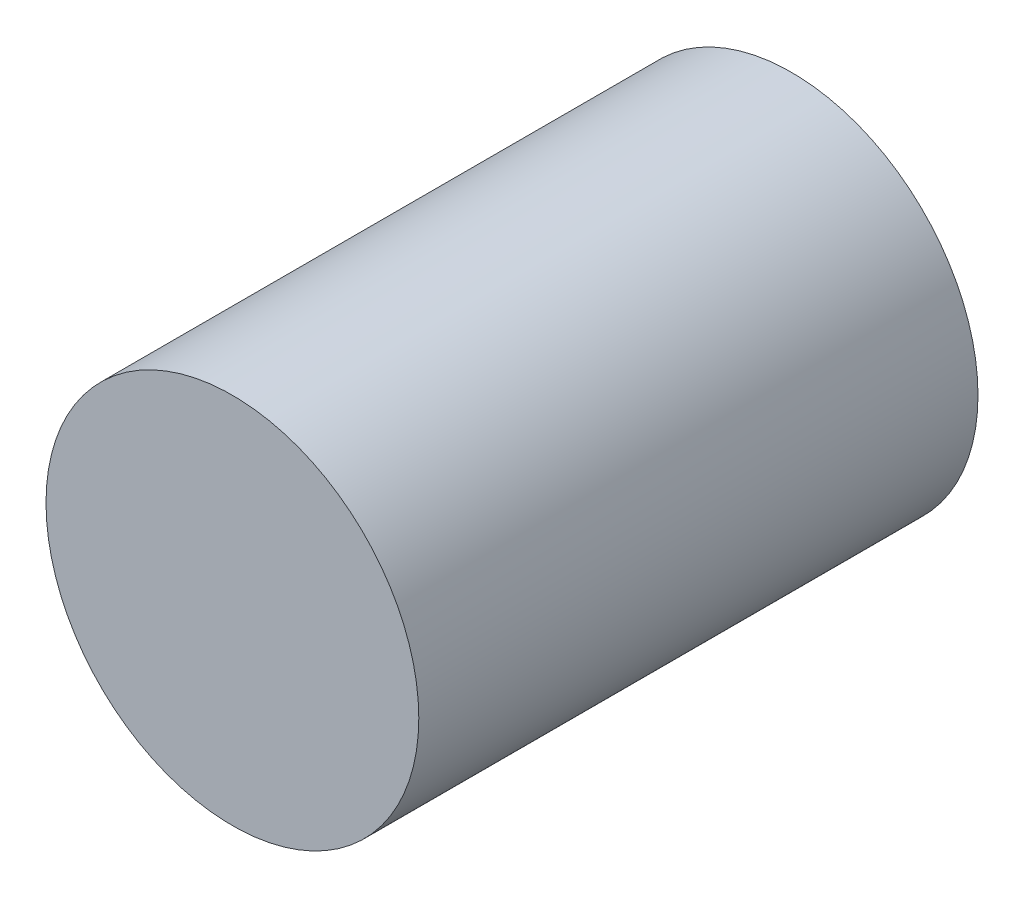
ISO-10303-21;
HEADER;
FILE_DESCRIPTION(('STEP AP214'),'2;1');
FILE_NAME('part.step','',(''),(''),'','','');
FILE_SCHEMA(('AUTOMOTIVE_DESIGN { 1 0 10303 214 1 1 1 1 }'));
ENDSEC;
DATA;
#1=APPLICATION_CONTEXT('core data for automotive mechanical design processes');
#2=APPLICATION_PROTOCOL_DEFINITION('international standard','automotive_design',2000,#1);
#3=PRODUCT_CONTEXT('',#1,'mechanical');
#4=PRODUCT('Part','Part','',(#3));
#5=PRODUCT_RELATED_PRODUCT_CATEGORY('part','',(#4));
#6=PRODUCT_DEFINITION_FORMATION('','',#4);
#7=PRODUCT_DEFINITION_CONTEXT('part definition',#1,'design');
#8=PRODUCT_DEFINITION('design','',#6,#7);
#9=PRODUCT_DEFINITION_SHAPE('','',#8);
#10=(LENGTH_UNIT() NAMED_UNIT(*) SI_UNIT(.MILLI.,.METRE.));
#11=(NAMED_UNIT(*) PLANE_ANGLE_UNIT() SI_UNIT($,.RADIAN.));
#12=(NAMED_UNIT(*) SI_UNIT($,.STERADIAN.) SOLID_ANGLE_UNIT());
#13=UNCERTAINTY_MEASURE_WITH_UNIT(LENGTH_MEASURE(1.E-05),#10,'distance_accuracy_value','');
#14=(GEOMETRIC_REPRESENTATION_CONTEXT(3) GLOBAL_UNCERTAINTY_ASSIGNED_CONTEXT((#13)) GLOBAL_UNIT_ASSIGNED_CONTEXT((#10,
#11,#12)) REPRESENTATION_CONTEXT('',''));
#15=CARTESIAN_POINT('',(0.,0.,0.));
#16=DIRECTION('',(0.,0.,1.));
#17=DIRECTION('',(1.,0.,0.));
#18=AXIS2_PLACEMENT_3D('',#15,#16,#17);
#19=CARTESIAN_POINT('',(0.,0.,30.));
#20=DIRECTION('',(0.,0.,-1.));
#21=DIRECTION('',(-1.,0.,0.));
#22=AXIS2_PLACEMENT_3D('',#19,#20,#21);
#23=CYLINDRICAL_SURFACE('',#22,10.);
#24=CARTESIAN_POINT('',(0.,0.,30.));
#25=DIRECTION('',(0.,0.,1.));
#26=DIRECTION('',(1.,0.,0.));
#27=AXIS2_PLACEMENT_3D('',#24,#25,#26);
#28=CIRCLE('',#27,10.);
#29=CARTESIAN_POINT('',(10.,0.,30.));
#30=VERTEX_POINT('',#29);
#31=EDGE_CURVE('E10',#30,#30,#28,.T.);
#32=ORIENTED_EDGE('',*,*,#31,.F.);
#33=EDGE_LOOP('',(#32));
#34=FACE_BOUND('',#33,.T.);
#35=CARTESIAN_POINT('',(0.,0.,0.));
#36=DIRECTION('',(0.,0.,1.));
#37=DIRECTION('',(1.,0.,0.));
#38=AXIS2_PLACEMENT_3D('',#35,#36,#37);
#39=CIRCLE('',#38,10.);
#40=CARTESIAN_POINT('',(10.,0.,0.));
#41=VERTEX_POINT('',#40);
#42=EDGE_CURVE('E42',#41,#41,#39,.T.);
#43=ORIENTED_EDGE('',*,*,#42,.T.);
#44=EDGE_LOOP('',(#43));
#45=FACE_BOUND('',#44,.T.);
#46=ADVANCED_FACE('F39',(#34,#45),#23,.T.);
#47=CARTESIAN_POINT('',(0.,0.,30.));
#48=DIRECTION('',(0.,0.,1.));
#49=DIRECTION('',(1.,0.,0.));
#50=AXIS2_PLACEMENT_3D('',#47,#48,#49);
#51=PLANE('',#50);
#52=ORIENTED_EDGE('',*,*,#31,.T.);
#53=EDGE_LOOP('',(#52));
#54=FACE_BOUND('',#53,.T.);
#55=ADVANCED_FACE('F54',(#54),#51,.T.);
#56=CARTESIAN_POINT('',(0.,0.,0.));
#57=DIRECTION('',(0.,0.,1.));
#58=DIRECTION('',(1.,0.,0.));
#59=AXIS2_PLACEMENT_3D('',#56,#57,#58);
#60=PLANE('',#59);
#61=ORIENTED_EDGE('',*,*,#42,.F.);
#62=EDGE_LOOP('',(#61));
#63=FACE_BOUND('',#62,.T.);
#64=ADVANCED_FACE('F52',(#63),#60,.F.);
#65=CLOSED_SHELL('',(#46,#55,#64));
#66=MANIFOLD_SOLID_BREP('B2',#65);
#67=ADVANCED_BREP_SHAPE_REPRESENTATION('',(#18,#66),#14);
#68=SHAPE_DEFINITION_REPRESENTATION(#9,#67);
ENDSEC;
END-ISO-10303-21;
